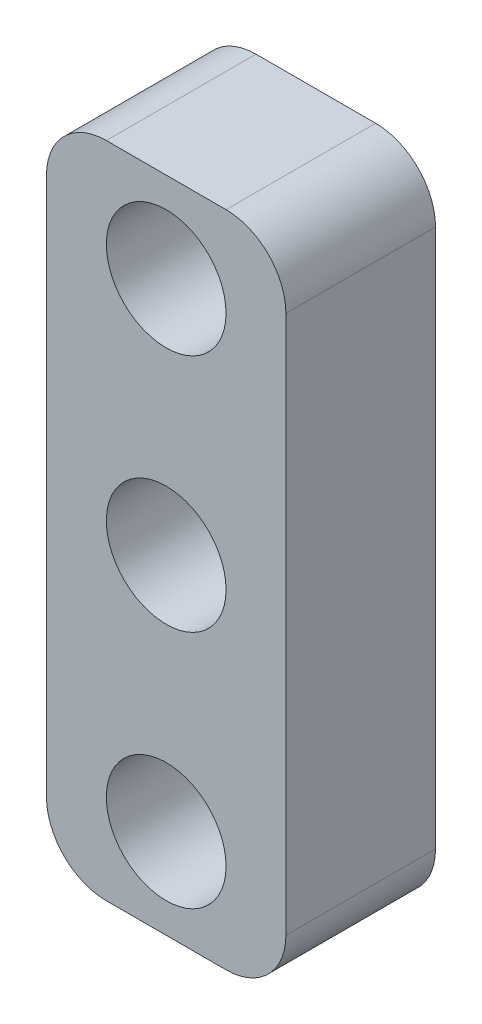
ISO-10303-21;
HEADER;
FILE_DESCRIPTION(('STEP AP214'),'2;1');
FILE_NAME('part.step','',(''),(''),'','','');
FILE_SCHEMA(('AUTOMOTIVE_DESIGN { 1 0 10303 214 1 1 1 1 }'));
ENDSEC;
DATA;
#1=APPLICATION_CONTEXT('core data for automotive mechanical design processes');
#2=APPLICATION_PROTOCOL_DEFINITION('international standard','automotive_design',2000,#1);
#3=PRODUCT_CONTEXT('',#1,'mechanical');
#4=PRODUCT('Part','Part','',(#3));
#5=PRODUCT_RELATED_PRODUCT_CATEGORY('part','',(#4));
#6=PRODUCT_DEFINITION_FORMATION('','',#4);
#7=PRODUCT_DEFINITION_CONTEXT('part definition',#1,'design');
#8=PRODUCT_DEFINITION('design','',#6,#7);
#9=PRODUCT_DEFINITION_SHAPE('','',#8);
#10=(LENGTH_UNIT() NAMED_UNIT(*) SI_UNIT(.MILLI.,.METRE.));
#11=(NAMED_UNIT(*) PLANE_ANGLE_UNIT() SI_UNIT($,.RADIAN.));
#12=(NAMED_UNIT(*) SI_UNIT($,.STERADIAN.) SOLID_ANGLE_UNIT());
#13=UNCERTAINTY_MEASURE_WITH_UNIT(LENGTH_MEASURE(1.E-05),#10,'distance_accuracy_value','');
#14=(GEOMETRIC_REPRESENTATION_CONTEXT(3) GLOBAL_UNCERTAINTY_ASSIGNED_CONTEXT((#13)) GLOBAL_UNIT_ASSIGNED_CONTEXT((#10,
#11,#12)) REPRESENTATION_CONTEXT('',''));
#15=CARTESIAN_POINT('',(0.,0.,0.));
#16=DIRECTION('',(0.,0.,1.));
#17=DIRECTION('',(1.,0.,0.));
#18=AXIS2_PLACEMENT_3D('',#15,#16,#17);
#19=CARTESIAN_POINT('',(6.,9.,5.));
#20=DIRECTION('',(0.,0.,-1.));
#21=DIRECTION('',(-1.,0.,0.));
#22=AXIS2_PLACEMENT_3D('',#19,#20,#21);
#23=CYLINDRICAL_SURFACE('',#22,2.);
#24=CARTESIAN_POINT('',(6.,9.,0.));
#25=DIRECTION('',(0.,0.,1.));
#26=DIRECTION('',(1.,0.,0.));
#27=AXIS2_PLACEMENT_3D('',#24,#25,#26);
#28=CIRCLE('',#27,2.);
#29=CARTESIAN_POINT('',(8.,9.,0.));
#30=VERTEX_POINT('',#29);
#31=CARTESIAN_POINT('',(6.,11.,0.));
#32=VERTEX_POINT('',#31);
#33=EDGE_CURVE('E133',#30,#32,#28,.T.);
#34=ORIENTED_EDGE('',*,*,#33,.T.);
#35=DIRECTION('',(0.,0.,-1.));
#36=VECTOR('',#35,1.);
#37=CARTESIAN_POINT('',(6.,11.,5.));
#38=LINE('',#37,#36);
#39=CARTESIAN_POINT('',(6.,11.,5.));
#40=VERTEX_POINT('',#39);
#41=EDGE_CURVE('E11',#40,#32,#38,.T.);
#42=ORIENTED_EDGE('',*,*,#41,.F.);
#43=CARTESIAN_POINT('',(6.,9.,5.));
#44=DIRECTION('',(0.,0.,1.));
#45=DIRECTION('',(1.,0.,0.));
#46=AXIS2_PLACEMENT_3D('',#43,#44,#45);
#47=CIRCLE('',#46,2.);
#48=CARTESIAN_POINT('',(8.,9.,5.));
#49=VERTEX_POINT('',#48);
#50=EDGE_CURVE('E148',#49,#40,#47,.T.);
#51=ORIENTED_EDGE('',*,*,#50,.F.);
#52=DIRECTION('',(0.,0.,-1.));
#53=VECTOR('',#52,1.);
#54=CARTESIAN_POINT('',(8.,9.,5.));
#55=LINE('',#54,#53);
#56=EDGE_CURVE('E129',#49,#30,#55,.T.);
#57=ORIENTED_EDGE('',*,*,#56,.T.);
#58=EDGE_LOOP('',(#34,#42,#51,#57));
#59=FACE_BOUND('',#58,.T.);
#60=ADVANCED_FACE('F37',(#59),#23,.T.);
#61=CARTESIAN_POINT('',(2.,11.,5.));
#62=DIRECTION('',(0.,-1.,0.));
#63=DIRECTION('',(1.,0.,0.));
#64=AXIS2_PLACEMENT_3D('',#61,#62,#63);
#65=PLANE('',#64);
#66=DIRECTION('',(-1.,0.,0.));
#67=VECTOR('',#66,1.);
#68=CARTESIAN_POINT('',(2.,11.,0.));
#69=LINE('',#68,#67);
#70=CARTESIAN_POINT('',(2.,11.,0.));
#71=VERTEX_POINT('',#70);
#72=EDGE_CURVE('E136',#32,#71,#69,.T.);
#73=ORIENTED_EDGE('',*,*,#72,.T.);
#74=DIRECTION('',(0.,0.,-1.));
#75=VECTOR('',#74,1.);
#76=CARTESIAN_POINT('',(2.,11.,5.));
#77=LINE('',#76,#75);
#78=CARTESIAN_POINT('',(2.,11.,5.));
#79=VERTEX_POINT('',#78);
#80=EDGE_CURVE('E45',#79,#71,#77,.T.);
#81=ORIENTED_EDGE('',*,*,#80,.F.);
#82=DIRECTION('',(-1.,0.,0.));
#83=VECTOR('',#82,1.);
#84=CARTESIAN_POINT('',(2.,11.,5.));
#85=LINE('',#84,#83);
#86=EDGE_CURVE('E96',#40,#79,#85,.T.);
#87=ORIENTED_EDGE('',*,*,#86,.F.);
#88=ORIENTED_EDGE('',*,*,#41,.T.);
#89=EDGE_LOOP('',(#73,#81,#87,#88));
#90=FACE_BOUND('',#89,.T.);
#91=ADVANCED_FACE('F224',(#90),#65,.F.);
#92=CARTESIAN_POINT('',(2.,9.,5.));
#93=DIRECTION('',(0.,0.,-1.));
#94=DIRECTION('',(-1.,0.,0.));
#95=AXIS2_PLACEMENT_3D('',#92,#93,#94);
#96=CYLINDRICAL_SURFACE('',#95,2.);
#97=CARTESIAN_POINT('',(2.,9.,0.));
#98=DIRECTION('',(0.,0.,1.));
#99=DIRECTION('',(-1.,0.,0.));
#100=AXIS2_PLACEMENT_3D('',#97,#98,#99);
#101=CIRCLE('',#100,2.);
#102=CARTESIAN_POINT('',(0.,9.,0.));
#103=VERTEX_POINT('',#102);
#104=EDGE_CURVE('E139',#71,#103,#101,.T.);
#105=ORIENTED_EDGE('',*,*,#104,.T.);
#106=DIRECTION('',(0.,0.,-1.));
#107=VECTOR('',#106,1.);
#108=CARTESIAN_POINT('',(0.,9.,5.));
#109=LINE('',#108,#107);
#110=CARTESIAN_POINT('',(0.,9.,5.));
#111=VERTEX_POINT('',#110);
#112=EDGE_CURVE('E155',#111,#103,#109,.T.);
#113=ORIENTED_EDGE('',*,*,#112,.F.);
#114=CARTESIAN_POINT('',(2.,9.,5.));
#115=DIRECTION('',(0.,0.,1.));
#116=DIRECTION('',(-1.,0.,0.));
#117=AXIS2_PLACEMENT_3D('',#114,#115,#116);
#118=CIRCLE('',#117,2.);
#119=EDGE_CURVE('E163',#79,#111,#118,.T.);
#120=ORIENTED_EDGE('',*,*,#119,.F.);
#121=ORIENTED_EDGE('',*,*,#80,.T.);
#122=EDGE_LOOP('',(#105,#113,#120,#121));
#123=FACE_BOUND('',#122,.T.);
#124=ADVANCED_FACE('F161',(#123),#96,.T.);
#125=CARTESIAN_POINT('',(0.,-9.,5.));
#126=DIRECTION('',(1.,0.,0.));
#127=DIRECTION('',(0.,1.,0.));
#128=AXIS2_PLACEMENT_3D('',#125,#126,#127);
#129=PLANE('',#128);
#130=DIRECTION('',(0.,-1.,0.));
#131=VECTOR('',#130,1.);
#132=CARTESIAN_POINT('',(0.,-9.,0.));
#133=LINE('',#132,#131);
#134=CARTESIAN_POINT('',(0.,-9.,0.));
#135=VERTEX_POINT('',#134);
#136=EDGE_CURVE('E141',#103,#135,#133,.T.);
#137=ORIENTED_EDGE('',*,*,#136,.T.);
#138=DIRECTION('',(0.,0.,-1.));
#139=VECTOR('',#138,1.);
#140=CARTESIAN_POINT('',(0.,-9.,5.));
#141=LINE('',#140,#139);
#142=CARTESIAN_POINT('',(0.,-9.,5.));
#143=VERTEX_POINT('',#142);
#144=EDGE_CURVE('E152',#143,#135,#141,.T.);
#145=ORIENTED_EDGE('',*,*,#144,.F.);
#146=DIRECTION('',(0.,-1.,0.));
#147=VECTOR('',#146,1.);
#148=CARTESIAN_POINT('',(0.,-9.,5.));
#149=LINE('',#148,#147);
#150=EDGE_CURVE('E175',#111,#143,#149,.T.);
#151=ORIENTED_EDGE('',*,*,#150,.F.);
#152=ORIENTED_EDGE('',*,*,#112,.T.);
#153=EDGE_LOOP('',(#137,#145,#151,#152));
#154=FACE_BOUND('',#153,.T.);
#155=ADVANCED_FACE('F171',(#154),#129,.F.);
#156=CARTESIAN_POINT('',(2.,-9.,5.));
#157=DIRECTION('',(0.,0.,-1.));
#158=DIRECTION('',(-1.,0.,0.));
#159=AXIS2_PLACEMENT_3D('',#156,#157,#158);
#160=CYLINDRICAL_SURFACE('',#159,2.);
#161=CARTESIAN_POINT('',(2.,-9.,0.));
#162=DIRECTION('',(0.,0.,1.));
#163=DIRECTION('',(1.,0.,0.));
#164=AXIS2_PLACEMENT_3D('',#161,#162,#163);
#165=CIRCLE('',#164,2.);
#166=CARTESIAN_POINT('',(2.,-11.,0.));
#167=VERTEX_POINT('',#166);
#168=EDGE_CURVE('E143',#135,#167,#165,.T.);
#169=ORIENTED_EDGE('',*,*,#168,.T.);
#170=DIRECTION('',(0.,0.,-1.));
#171=VECTOR('',#170,1.);
#172=CARTESIAN_POINT('',(2.,-11.,5.));
#173=LINE('',#172,#171);
#174=CARTESIAN_POINT('',(2.,-11.,5.));
#175=VERTEX_POINT('',#174);
#176=EDGE_CURVE('E124',#175,#167,#173,.T.);
#177=ORIENTED_EDGE('',*,*,#176,.F.);
#178=CARTESIAN_POINT('',(2.,-9.,5.));
#179=DIRECTION('',(0.,0.,1.));
#180=DIRECTION('',(1.,0.,0.));
#181=AXIS2_PLACEMENT_3D('',#178,#179,#180);
#182=CIRCLE('',#181,2.);
#183=EDGE_CURVE('E115',#143,#175,#182,.T.);
#184=ORIENTED_EDGE('',*,*,#183,.F.);
#185=ORIENTED_EDGE('',*,*,#144,.T.);
#186=EDGE_LOOP('',(#169,#177,#184,#185));
#187=FACE_BOUND('',#186,.T.);
#188=ADVANCED_FACE('F174',(#187),#160,.T.);
#189=CARTESIAN_POINT('',(2.,-11.,5.));
#190=DIRECTION('',(0.,1.,0.));
#191=DIRECTION('',(-1.,0.,0.));
#192=AXIS2_PLACEMENT_3D('',#189,#190,#191);
#193=PLANE('',#192);
#194=DIRECTION('',(1.,0.,0.));
#195=VECTOR('',#194,1.);
#196=CARTESIAN_POINT('',(2.,-11.,0.));
#197=LINE('',#196,#195);
#198=CARTESIAN_POINT('',(6.,-11.,0.));
#199=VERTEX_POINT('',#198);
#200=EDGE_CURVE('E123',#167,#199,#197,.T.);
#201=ORIENTED_EDGE('',*,*,#200,.T.);
#202=DIRECTION('',(0.,0.,-1.));
#203=VECTOR('',#202,1.);
#204=CARTESIAN_POINT('',(6.,-11.,5.));
#205=LINE('',#204,#203);
#206=CARTESIAN_POINT('',(6.,-11.,5.));
#207=VERTEX_POINT('',#206);
#208=EDGE_CURVE('E120',#207,#199,#205,.T.);
#209=ORIENTED_EDGE('',*,*,#208,.F.);
#210=DIRECTION('',(1.,0.,0.));
#211=VECTOR('',#210,1.);
#212=CARTESIAN_POINT('',(2.,-11.,5.));
#213=LINE('',#212,#211);
#214=EDGE_CURVE('E109',#175,#207,#213,.T.);
#215=ORIENTED_EDGE('',*,*,#214,.F.);
#216=ORIENTED_EDGE('',*,*,#176,.T.);
#217=EDGE_LOOP('',(#201,#209,#215,#216));
#218=FACE_BOUND('',#217,.T.);
#219=ADVANCED_FACE('F121',(#218),#193,.F.);
#220=CARTESIAN_POINT('',(6.,-9.,5.));
#221=DIRECTION('',(0.,0.,-1.));
#222=DIRECTION('',(-1.,0.,0.));
#223=AXIS2_PLACEMENT_3D('',#220,#221,#222);
#224=CYLINDRICAL_SURFACE('',#223,2.);
#225=CARTESIAN_POINT('',(6.,-9.,0.));
#226=DIRECTION('',(0.,0.,1.));
#227=DIRECTION('',(-1.,0.,0.));
#228=AXIS2_PLACEMENT_3D('',#225,#226,#227);
#229=CIRCLE('',#228,2.);
#230=CARTESIAN_POINT('',(8.,-9.,0.));
#231=VERTEX_POINT('',#230);
#232=EDGE_CURVE('E82',#199,#231,#229,.T.);
#233=ORIENTED_EDGE('',*,*,#232,.T.);
#234=DIRECTION('',(0.,0.,-1.));
#235=VECTOR('',#234,1.);
#236=CARTESIAN_POINT('',(8.,-9.,5.));
#237=LINE('',#236,#235);
#238=CARTESIAN_POINT('',(8.,-9.,5.));
#239=VERTEX_POINT('',#238);
#240=EDGE_CURVE('E125',#239,#231,#237,.T.);
#241=ORIENTED_EDGE('',*,*,#240,.F.);
#242=CARTESIAN_POINT('',(6.,-9.,5.));
#243=DIRECTION('',(0.,0.,1.));
#244=DIRECTION('',(-1.,0.,0.));
#245=AXIS2_PLACEMENT_3D('',#242,#243,#244);
#246=CIRCLE('',#245,2.);
#247=EDGE_CURVE('E113',#207,#239,#246,.T.);
#248=ORIENTED_EDGE('',*,*,#247,.F.);
#249=ORIENTED_EDGE('',*,*,#208,.T.);
#250=EDGE_LOOP('',(#233,#241,#248,#249));
#251=FACE_BOUND('',#250,.T.);
#252=ADVANCED_FACE('F127',(#251),#224,.T.);
#253=CARTESIAN_POINT('',(8.,-9.,5.));
#254=DIRECTION('',(-1.,0.,0.));
#255=DIRECTION('',(0.,-1.,0.));
#256=AXIS2_PLACEMENT_3D('',#253,#254,#255);
#257=PLANE('',#256);
#258=DIRECTION('',(0.,1.,0.));
#259=VECTOR('',#258,1.);
#260=CARTESIAN_POINT('',(8.,-9.,0.));
#261=LINE('',#260,#259);
#262=EDGE_CURVE('E88',#231,#30,#261,.T.);
#263=ORIENTED_EDGE('',*,*,#262,.T.);
#264=ORIENTED_EDGE('',*,*,#56,.F.);
#265=DIRECTION('',(0.,1.,0.));
#266=VECTOR('',#265,1.);
#267=CARTESIAN_POINT('',(8.,-9.,5.));
#268=LINE('',#267,#266);
#269=EDGE_CURVE('E53',#239,#49,#268,.T.);
#270=ORIENTED_EDGE('',*,*,#269,.F.);
#271=ORIENTED_EDGE('',*,*,#240,.T.);
#272=EDGE_LOOP('',(#263,#264,#270,#271));
#273=FACE_BOUND('',#272,.T.);
#274=ADVANCED_FACE('F203',(#273),#257,.F.);
#275=CARTESIAN_POINT('',(6.,9.,5.));
#276=DIRECTION('',(0.,0.,1.));
#277=DIRECTION('',(1.,0.,0.));
#278=AXIS2_PLACEMENT_3D('',#275,#276,#277);
#279=PLANE('',#278);
#280=CARTESIAN_POINT('',(4.,-8.,5.));
#281=DIRECTION('',(0.,0.,1.));
#282=DIRECTION('',(1.,0.,0.));
#283=AXIS2_PLACEMENT_3D('',#280,#281,#282);
#284=CIRCLE('',#283,2.);
#285=CARTESIAN_POINT('',(6.,-8.,5.));
#286=VERTEX_POINT('',#285);
#287=EDGE_CURVE('E190',#286,#286,#284,.T.);
#288=ORIENTED_EDGE('',*,*,#287,.F.);
#289=EDGE_LOOP('',(#288));
#290=FACE_BOUND('',#289,.T.);
#291=CARTESIAN_POINT('',(4.,8.,5.));
#292=DIRECTION('',(0.,0.,1.));
#293=DIRECTION('',(1.,0.,0.));
#294=AXIS2_PLACEMENT_3D('',#291,#292,#293);
#295=CIRCLE('',#294,2.);
#296=CARTESIAN_POINT('',(6.,8.,5.));
#297=VERTEX_POINT('',#296);
#298=EDGE_CURVE('E184',#297,#297,#295,.T.);
#299=ORIENTED_EDGE('',*,*,#298,.F.);
#300=EDGE_LOOP('',(#299));
#301=FACE_BOUND('',#300,.T.);
#302=CARTESIAN_POINT('',(4.,0.,5.));
#303=DIRECTION('',(0.,0.,1.));
#304=DIRECTION('',(1.,0.,0.));
#305=AXIS2_PLACEMENT_3D('',#302,#303,#304);
#306=CIRCLE('',#305,2.);
#307=CARTESIAN_POINT('',(6.,0.,5.));
#308=VERTEX_POINT('',#307);
#309=EDGE_CURVE('E181',#308,#308,#306,.T.);
#310=ORIENTED_EDGE('',*,*,#309,.F.);
#311=EDGE_LOOP('',(#310));
#312=FACE_BOUND('',#311,.T.);
#313=ORIENTED_EDGE('',*,*,#50,.T.);
#314=ORIENTED_EDGE('',*,*,#86,.T.);
#315=ORIENTED_EDGE('',*,*,#119,.T.);
#316=ORIENTED_EDGE('',*,*,#150,.T.);
#317=ORIENTED_EDGE('',*,*,#183,.T.);
#318=ORIENTED_EDGE('',*,*,#214,.T.);
#319=ORIENTED_EDGE('',*,*,#247,.T.);
#320=ORIENTED_EDGE('',*,*,#269,.T.);
#321=EDGE_LOOP('',(#313,#314,#315,#316,#317,#318,#319,#320));
#322=FACE_BOUND('',#321,.T.);
#323=ADVANCED_FACE('F111',(#290,#301,#312,#322),#279,.T.);
#324=CARTESIAN_POINT('',(6.,9.,0.));
#325=DIRECTION('',(0.,0.,1.));
#326=DIRECTION('',(1.,0.,0.));
#327=AXIS2_PLACEMENT_3D('',#324,#325,#326);
#328=PLANE('',#327);
#329=CARTESIAN_POINT('',(4.,-8.,0.));
#330=DIRECTION('',(0.,0.,1.));
#331=DIRECTION('',(1.,0.,0.));
#332=AXIS2_PLACEMENT_3D('',#329,#330,#331);
#333=CIRCLE('',#332,2.);
#334=CARTESIAN_POINT('',(6.,-8.,0.));
#335=VERTEX_POINT('',#334);
#336=EDGE_CURVE('E187',#335,#335,#333,.T.);
#337=ORIENTED_EDGE('',*,*,#336,.T.);
#338=EDGE_LOOP('',(#337));
#339=FACE_BOUND('',#338,.T.);
#340=CARTESIAN_POINT('',(4.,8.,0.));
#341=DIRECTION('',(0.,0.,1.));
#342=DIRECTION('',(1.,0.,0.));
#343=AXIS2_PLACEMENT_3D('',#340,#341,#342);
#344=CIRCLE('',#343,2.);
#345=CARTESIAN_POINT('',(6.,8.,0.));
#346=VERTEX_POINT('',#345);
#347=EDGE_CURVE('E193',#346,#346,#344,.T.);
#348=ORIENTED_EDGE('',*,*,#347,.T.);
#349=EDGE_LOOP('',(#348));
#350=FACE_BOUND('',#349,.T.);
#351=CARTESIAN_POINT('',(4.,0.,0.));
#352=DIRECTION('',(0.,0.,1.));
#353=DIRECTION('',(1.,0.,0.));
#354=AXIS2_PLACEMENT_3D('',#351,#352,#353);
#355=CIRCLE('',#354,2.);
#356=CARTESIAN_POINT('',(6.,0.,0.));
#357=VERTEX_POINT('',#356);
#358=EDGE_CURVE('E137',#357,#357,#355,.T.);
#359=ORIENTED_EDGE('',*,*,#358,.T.);
#360=EDGE_LOOP('',(#359));
#361=FACE_BOUND('',#360,.T.);
#362=ORIENTED_EDGE('',*,*,#33,.F.);
#363=ORIENTED_EDGE('',*,*,#262,.F.);
#364=ORIENTED_EDGE('',*,*,#232,.F.);
#365=ORIENTED_EDGE('',*,*,#200,.F.);
#366=ORIENTED_EDGE('',*,*,#168,.F.);
#367=ORIENTED_EDGE('',*,*,#136,.F.);
#368=ORIENTED_EDGE('',*,*,#104,.F.);
#369=ORIENTED_EDGE('',*,*,#72,.F.);
#370=EDGE_LOOP('',(#362,#363,#364,#365,#366,#367,#368,#369));
#371=FACE_BOUND('',#370,.T.);
#372=ADVANCED_FACE('F167',(#339,#350,#361,#371),#328,.F.);
#373=CARTESIAN_POINT('',(4.,0.,0.));
#374=DIRECTION('',(0.,0.,1.));
#375=DIRECTION('',(1.,0.,0.));
#376=AXIS2_PLACEMENT_3D('',#373,#374,#375);
#377=CYLINDRICAL_SURFACE('',#376,2.);
#378=ORIENTED_EDGE('',*,*,#358,.F.);
#379=EDGE_LOOP('',(#378));
#380=FACE_BOUND('',#379,.T.);
#381=ORIENTED_EDGE('',*,*,#309,.T.);
#382=EDGE_LOOP('',(#381));
#383=FACE_BOUND('',#382,.T.);
#384=ADVANCED_FACE('F208',(#380,#383),#377,.F.);
#385=CARTESIAN_POINT('',(4.,8.,0.));
#386=DIRECTION('',(0.,0.,1.));
#387=DIRECTION('',(1.,0.,0.));
#388=AXIS2_PLACEMENT_3D('',#385,#386,#387);
#389=CYLINDRICAL_SURFACE('',#388,2.);
#390=ORIENTED_EDGE('',*,*,#347,.F.);
#391=EDGE_LOOP('',(#390));
#392=FACE_BOUND('',#391,.T.);
#393=ORIENTED_EDGE('',*,*,#298,.T.);
#394=EDGE_LOOP('',(#393));
#395=FACE_BOUND('',#394,.T.);
#396=ADVANCED_FACE('F199',(#392,#395),#389,.F.);
#397=CARTESIAN_POINT('',(4.,-8.,0.));
#398=DIRECTION('',(0.,0.,1.));
#399=DIRECTION('',(1.,0.,0.));
#400=AXIS2_PLACEMENT_3D('',#397,#398,#399);
#401=CYLINDRICAL_SURFACE('',#400,2.);
#402=ORIENTED_EDGE('',*,*,#336,.F.);
#403=EDGE_LOOP('',(#402));
#404=FACE_BOUND('',#403,.T.);
#405=ORIENTED_EDGE('',*,*,#287,.T.);
#406=EDGE_LOOP('',(#405));
#407=FACE_BOUND('',#406,.T.);
#408=ADVANCED_FACE('F216',(#404,#407),#401,.F.);
#409=CLOSED_SHELL('',(#60,#91,#124,#155,#188,#219,#252,#274,#323,#372,#384,#396,#408));
#410=MANIFOLD_SOLID_BREP('B2',#409);
#411=ADVANCED_BREP_SHAPE_REPRESENTATION('',(#18,#410),#14);
#412=SHAPE_DEFINITION_REPRESENTATION(#9,#411);
ENDSEC;
END-ISO-10303-21;
